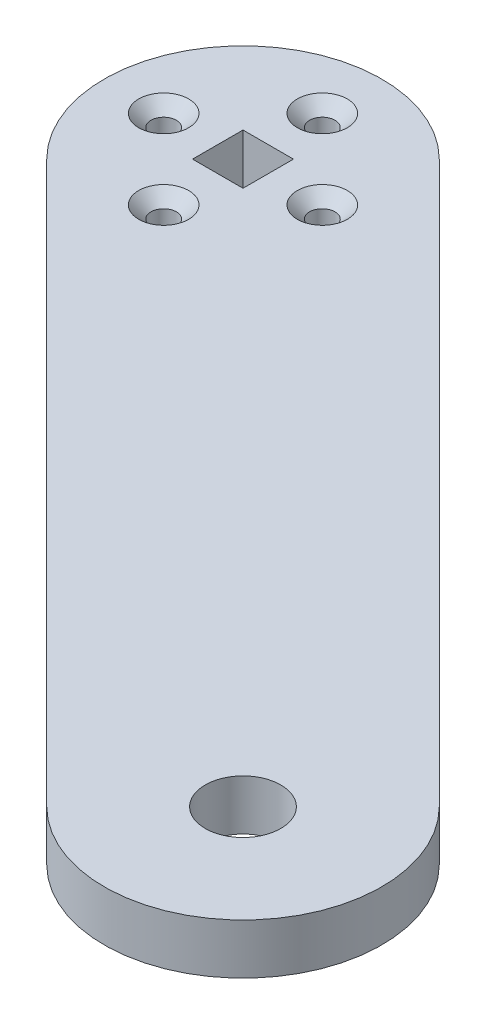
ISO-10303-21;
HEADER;
FILE_DESCRIPTION(('STEP AP214'),'2;1');
FILE_NAME('part.step','',(''),(''),'','','');
FILE_SCHEMA(('AUTOMOTIVE_DESIGN { 1 0 10303 214 1 1 1 1 }'));
ENDSEC;
DATA;
#1=APPLICATION_CONTEXT('core data for automotive mechanical design processes');
#2=APPLICATION_PROTOCOL_DEFINITION('international standard','automotive_design',2000,#1);
#3=PRODUCT_CONTEXT('',#1,'mechanical');
#4=PRODUCT('Part','Part','',(#3));
#5=PRODUCT_RELATED_PRODUCT_CATEGORY('part','',(#4));
#6=PRODUCT_DEFINITION_FORMATION('','',#4);
#7=PRODUCT_DEFINITION_CONTEXT('part definition',#1,'design');
#8=PRODUCT_DEFINITION('design','',#6,#7);
#9=PRODUCT_DEFINITION_SHAPE('','',#8);
#10=(LENGTH_UNIT() NAMED_UNIT(*) SI_UNIT(.MILLI.,.METRE.));
#11=(NAMED_UNIT(*) PLANE_ANGLE_UNIT() SI_UNIT($,.RADIAN.));
#12=(NAMED_UNIT(*) SI_UNIT($,.STERADIAN.) SOLID_ANGLE_UNIT());
#13=UNCERTAINTY_MEASURE_WITH_UNIT(LENGTH_MEASURE(1.E-05),#10,'distance_accuracy_value','');
#14=(GEOMETRIC_REPRESENTATION_CONTEXT(3) GLOBAL_UNCERTAINTY_ASSIGNED_CONTEXT((#13)) GLOBAL_UNIT_ASSIGNED_CONTEXT((#10,
#11,#12)) REPRESENTATION_CONTEXT('',''));
#15=CARTESIAN_POINT('',(0.,0.,0.));
#16=DIRECTION('',(0.,0.,1.));
#17=DIRECTION('',(1.,0.,0.));
#18=AXIS2_PLACEMENT_3D('',#15,#16,#17);
#19=CARTESIAN_POINT('',(0.,-6.35,0.));
#20=DIRECTION('',(0.,1.,0.));
#21=DIRECTION('',(0.,0.,1.));
#22=AXIS2_PLACEMENT_3D('',#19,#20,#21);
#23=CYLINDRICAL_SURFACE('',#22,17.5);
#24=CARTESIAN_POINT('',(0.,0.,0.));
#25=DIRECTION('',(0.,1.,0.));
#26=DIRECTION('',(0.,0.,1.));
#27=AXIS2_PLACEMENT_3D('',#24,#25,#26);
#28=CIRCLE('',#27,17.5);
#29=CARTESIAN_POINT('',(12.3743686707646,0.,-12.3743686707646));
#30=VERTEX_POINT('',#29);
#31=CARTESIAN_POINT('',(-12.3743686707646,0.,12.3743686707646));
#32=VERTEX_POINT('',#31);
#33=EDGE_CURVE('E139',#30,#32,#28,.T.);
#34=ORIENTED_EDGE('',*,*,#33,.F.);
#35=DIRECTION('',(0.,1.,0.));
#36=VECTOR('',#35,1.);
#37=CARTESIAN_POINT('',(12.3743686707646,-6.35,-12.3743686707646));
#38=LINE('',#37,#36);
#39=CARTESIAN_POINT('',(12.3743686707646,-6.35,-12.3743686707646));
#40=VERTEX_POINT('',#39);
#41=EDGE_CURVE('E11',#40,#30,#38,.T.);
#42=ORIENTED_EDGE('',*,*,#41,.F.);
#43=CARTESIAN_POINT('',(0.,-6.35,0.));
#44=DIRECTION('',(0.,1.,0.));
#45=DIRECTION('',(0.,0.,1.));
#46=AXIS2_PLACEMENT_3D('',#43,#44,#45);
#47=CIRCLE('',#46,17.5);
#48=CARTESIAN_POINT('',(-12.3743686707646,-6.35,12.3743686707646));
#49=VERTEX_POINT('',#48);
#50=EDGE_CURVE('E143',#40,#49,#47,.T.);
#51=ORIENTED_EDGE('',*,*,#50,.T.);
#52=DIRECTION('',(0.,1.,0.));
#53=VECTOR('',#52,1.);
#54=CARTESIAN_POINT('',(-12.3743686707646,-6.35,12.3743686707646));
#55=LINE('',#54,#53);
#56=EDGE_CURVE('E40',#49,#32,#55,.T.);
#57=ORIENTED_EDGE('',*,*,#56,.T.);
#58=EDGE_LOOP('',(#34,#42,#51,#57));
#59=FACE_BOUND('',#58,.T.);
#60=ADVANCED_FACE('F37',(#59),#23,.T.);
#61=CARTESIAN_POINT('',(12.3743686707646,-6.35,-12.3743686707646));
#62=DIRECTION('',(0.707106781186549,0.,-0.707106781186546));
#63=DIRECTION('',(-0.707106781186546,0.,-0.707106781186549));
#64=AXIS2_PLACEMENT_3D('',#61,#62,#63);
#65=PLANE('',#64);
#66=DIRECTION('',(-0.707106781186546,0.,-0.707106781186549));
#67=VECTOR('',#66,1.);
#68=CARTESIAN_POINT('',(12.3743686707646,0.,-12.3743686707646));
#69=LINE('',#68,#67);
#70=CARTESIAN_POINT('',(83.0850467894193,0.,58.3363094478903));
#71=VERTEX_POINT('',#70);
#72=EDGE_CURVE('E147',#71,#30,#69,.T.);
#73=ORIENTED_EDGE('',*,*,#72,.F.);
#74=DIRECTION('',(0.,1.,0.));
#75=VECTOR('',#74,1.);
#76=CARTESIAN_POINT('',(83.0850467894193,-6.35,58.3363094478903));
#77=LINE('',#76,#75);
#78=CARTESIAN_POINT('',(83.0850467894193,-6.35,58.3363094478903));
#79=VERTEX_POINT('',#78);
#80=EDGE_CURVE('E45',#79,#71,#77,.T.);
#81=ORIENTED_EDGE('',*,*,#80,.F.);
#82=DIRECTION('',(-0.707106781186546,0.,-0.707106781186549));
#83=VECTOR('',#82,1.);
#84=CARTESIAN_POINT('',(12.3743686707646,-6.35,-12.3743686707646));
#85=LINE('',#84,#83);
#86=EDGE_CURVE('E153',#79,#40,#85,.T.);
#87=ORIENTED_EDGE('',*,*,#86,.T.);
#88=ORIENTED_EDGE('',*,*,#41,.T.);
#89=EDGE_LOOP('',(#73,#81,#87,#88));
#90=FACE_BOUND('',#89,.T.);
#91=ADVANCED_FACE('F179',(#90),#65,.T.);
#92=CARTESIAN_POINT('',(70.7106781186546,-6.35,70.7106781186549));
#93=DIRECTION('',(0.,1.,0.));
#94=DIRECTION('',(0.,0.,1.));
#95=AXIS2_PLACEMENT_3D('',#92,#93,#94);
#96=CYLINDRICAL_SURFACE('',#95,17.5);
#97=CARTESIAN_POINT('',(70.7106781186546,0.,70.7106781186549));
#98=DIRECTION('',(0.,1.,0.));
#99=DIRECTION('',(0.,0.,-1.));
#100=AXIS2_PLACEMENT_3D('',#97,#98,#99);
#101=CIRCLE('',#100,17.5);
#102=CARTESIAN_POINT('',(58.33630944789,0.,83.0850467894194));
#103=VERTEX_POINT('',#102);
#104=EDGE_CURVE('E161',#103,#71,#101,.T.);
#105=ORIENTED_EDGE('',*,*,#104,.F.);
#106=DIRECTION('',(0.,1.,0.));
#107=VECTOR('',#106,1.);
#108=CARTESIAN_POINT('',(58.33630944789,-6.35,83.0850467894194));
#109=LINE('',#108,#107);
#110=CARTESIAN_POINT('',(58.33630944789,-6.35,83.0850467894194));
#111=VERTEX_POINT('',#110);
#112=EDGE_CURVE('E166',#111,#103,#109,.T.);
#113=ORIENTED_EDGE('',*,*,#112,.F.);
#114=CARTESIAN_POINT('',(70.7106781186546,-6.35,70.7106781186549));
#115=DIRECTION('',(0.,1.,0.));
#116=DIRECTION('',(0.,0.,-1.));
#117=AXIS2_PLACEMENT_3D('',#114,#115,#116);
#118=CIRCLE('',#117,17.5);
#119=EDGE_CURVE('E150',#111,#79,#118,.T.);
#120=ORIENTED_EDGE('',*,*,#119,.T.);
#121=ORIENTED_EDGE('',*,*,#80,.T.);
#122=EDGE_LOOP('',(#105,#113,#120,#121));
#123=FACE_BOUND('',#122,.T.);
#124=ADVANCED_FACE('F183',(#123),#96,.T.);
#125=CARTESIAN_POINT('',(-12.3743686707646,-6.35,12.3743686707646));
#126=DIRECTION('',(-0.707106781186549,0.,0.707106781186546));
#127=DIRECTION('',(0.707106781186546,0.,0.707106781186549));
#128=AXIS2_PLACEMENT_3D('',#125,#126,#127);
#129=PLANE('',#128);
#130=DIRECTION('',(0.707106781186546,0.,0.707106781186549));
#131=VECTOR('',#130,1.);
#132=CARTESIAN_POINT('',(-12.3743686707646,0.,12.3743686707646));
#133=LINE('',#132,#131);
#134=EDGE_CURVE('E158',#32,#103,#133,.T.);
#135=ORIENTED_EDGE('',*,*,#134,.F.);
#136=ORIENTED_EDGE('',*,*,#56,.F.);
#137=DIRECTION('',(0.707106781186546,0.,0.707106781186549));
#138=VECTOR('',#137,1.);
#139=CARTESIAN_POINT('',(-12.3743686707646,-6.35,12.3743686707646));
#140=LINE('',#139,#138);
#141=EDGE_CURVE('E146',#49,#111,#140,.T.);
#142=ORIENTED_EDGE('',*,*,#141,.T.);
#143=ORIENTED_EDGE('',*,*,#112,.T.);
#144=EDGE_LOOP('',(#135,#136,#142,#143));
#145=FACE_BOUND('',#144,.T.);
#146=ADVANCED_FACE('F174',(#145),#129,.T.);
#147=CARTESIAN_POINT('',(0.,-6.35,0.));
#148=DIRECTION('',(0.,1.,0.));
#149=DIRECTION('',(0.,0.,1.));
#150=AXIS2_PLACEMENT_3D('',#147,#148,#149);
#151=PLANE('',#150);
#152=CARTESIAN_POINT('',(0.,-6.35,-10.));
#153=DIRECTION('',(0.,1.,0.));
#154=DIRECTION('',(0.,0.,1.));
#155=AXIS2_PLACEMENT_3D('',#152,#153,#154);
#156=CIRCLE('',#155,1.6);
#157=CARTESIAN_POINT('',(0.,-6.35,-8.4));
#158=VERTEX_POINT('',#157);
#159=EDGE_CURVE('E363',#158,#158,#156,.T.);
#160=ORIENTED_EDGE('',*,*,#159,.T.);
#161=EDGE_LOOP('',(#160));
#162=FACE_BOUND('',#161,.T.);
#163=CARTESIAN_POINT('',(-10.,-6.35,0.));
#164=DIRECTION('',(0.,1.,0.));
#165=DIRECTION('',(0.,0.,1.));
#166=AXIS2_PLACEMENT_3D('',#163,#164,#165);
#167=CIRCLE('',#166,1.6);
#168=CARTESIAN_POINT('',(-10.,-6.35,1.6));
#169=VERTEX_POINT('',#168);
#170=EDGE_CURVE('E374',#169,#169,#167,.T.);
#171=ORIENTED_EDGE('',*,*,#170,.T.);
#172=EDGE_LOOP('',(#171));
#173=FACE_BOUND('',#172,.T.);
#174=CARTESIAN_POINT('',(10.,-6.35,0.));
#175=DIRECTION('',(0.,1.,0.));
#176=DIRECTION('',(0.,0.,1.));
#177=AXIS2_PLACEMENT_3D('',#174,#175,#176);
#178=CIRCLE('',#177,1.6);
#179=CARTESIAN_POINT('',(10.,-6.35,1.6));
#180=VERTEX_POINT('',#179);
#181=EDGE_CURVE('E383',#180,#180,#178,.T.);
#182=ORIENTED_EDGE('',*,*,#181,.T.);
#183=EDGE_LOOP('',(#182));
#184=FACE_BOUND('',#183,.T.);
#185=CARTESIAN_POINT('',(0.,-6.35,10.));
#186=DIRECTION('',(0.,1.,0.));
#187=DIRECTION('',(0.,0.,1.));
#188=AXIS2_PLACEMENT_3D('',#185,#186,#187);
#189=CIRCLE('',#188,1.6);
#190=CARTESIAN_POINT('',(0.,-6.35,11.6));
#191=VERTEX_POINT('',#190);
#192=EDGE_CURVE('E392',#191,#191,#189,.T.);
#193=ORIENTED_EDGE('',*,*,#192,.T.);
#194=EDGE_LOOP('',(#193));
#195=FACE_BOUND('',#194,.T.);
#196=CARTESIAN_POINT('',(70.7106781186546,-6.35,70.7106781186549));
#197=DIRECTION('',(0.,1.,0.));
#198=DIRECTION('',(0.,0.,1.));
#199=AXIS2_PLACEMENT_3D('',#196,#197,#198);
#200=CIRCLE('',#199,4.7625);
#201=CARTESIAN_POINT('',(70.7106781186546,-6.35,75.4731781186549));
#202=VERTEX_POINT('',#201);
#203=EDGE_CURVE('E133',#202,#202,#200,.T.);
#204=ORIENTED_EDGE('',*,*,#203,.T.);
#205=EDGE_LOOP('',(#204));
#206=FACE_BOUND('',#205,.T.);
#207=DIRECTION('',(-1.,0.,0.));
#208=VECTOR('',#207,1.);
#209=CARTESIAN_POINT('',(-3.18,-6.35,-3.18));
#210=LINE('',#209,#208);
#211=CARTESIAN_POINT('',(3.18,-6.35,-3.18));
#212=VERTEX_POINT('',#211);
#213=CARTESIAN_POINT('',(-3.18,-6.35,-3.18));
#214=VERTEX_POINT('',#213);
#215=EDGE_CURVE('E110',#212,#214,#210,.T.);
#216=ORIENTED_EDGE('',*,*,#215,.T.);
#217=DIRECTION('',(0.,0.,1.));
#218=VECTOR('',#217,1.);
#219=CARTESIAN_POINT('',(-3.18,-6.35,-3.18));
#220=LINE('',#219,#218);
#221=CARTESIAN_POINT('',(-3.18,-6.35,3.18));
#222=VERTEX_POINT('',#221);
#223=EDGE_CURVE('E104',#214,#222,#220,.T.);
#224=ORIENTED_EDGE('',*,*,#223,.T.);
#225=DIRECTION('',(1.,0.,0.));
#226=VECTOR('',#225,1.);
#227=CARTESIAN_POINT('',(-3.18,-6.35,3.18));
#228=LINE('',#227,#226);
#229=CARTESIAN_POINT('',(3.18,-6.35,3.18));
#230=VERTEX_POINT('',#229);
#231=EDGE_CURVE('E113',#222,#230,#228,.T.);
#232=ORIENTED_EDGE('',*,*,#231,.T.);
#233=DIRECTION('',(0.,0.,-1.));
#234=VECTOR('',#233,1.);
#235=CARTESIAN_POINT('',(3.18,-6.35,-3.18));
#236=LINE('',#235,#234);
#237=EDGE_CURVE('E53',#230,#212,#236,.T.);
#238=ORIENTED_EDGE('',*,*,#237,.T.);
#239=EDGE_LOOP('',(#216,#224,#232,#238));
#240=FACE_BOUND('',#239,.T.);
#241=ORIENTED_EDGE('',*,*,#50,.F.);
#242=ORIENTED_EDGE('',*,*,#86,.F.);
#243=ORIENTED_EDGE('',*,*,#119,.F.);
#244=ORIENTED_EDGE('',*,*,#141,.F.);
#245=EDGE_LOOP('',(#241,#242,#243,#244));
#246=FACE_BOUND('',#245,.T.);
#247=ADVANCED_FACE('F117',(#162,#173,#184,#195,#206,#240,#246),#151,.F.);
#248=CARTESIAN_POINT('',(0.,0.,0.));
#249=DIRECTION('',(0.,1.,0.));
#250=DIRECTION('',(0.,0.,1.));
#251=AXIS2_PLACEMENT_3D('',#248,#249,#250);
#252=PLANE('',#251);
#253=CARTESIAN_POINT('',(0.,0.,-10.));
#254=DIRECTION('',(0.,1.,0.));
#255=DIRECTION('',(0.,0.,1.));
#256=AXIS2_PLACEMENT_3D('',#253,#254,#255);
#257=CIRCLE('',#256,3.15);
#258=CARTESIAN_POINT('',(0.,0.,-6.85));
#259=VERTEX_POINT('',#258);
#260=EDGE_CURVE('E361',#259,#259,#257,.T.);
#261=ORIENTED_EDGE('',*,*,#260,.F.);
#262=EDGE_LOOP('',(#261));
#263=FACE_BOUND('',#262,.T.);
#264=CARTESIAN_POINT('',(-10.,0.,0.));
#265=DIRECTION('',(0.,1.,0.));
#266=DIRECTION('',(0.,0.,1.));
#267=AXIS2_PLACEMENT_3D('',#264,#265,#266);
#268=CIRCLE('',#267,3.15);
#269=CARTESIAN_POINT('',(-10.,0.,3.15));
#270=VERTEX_POINT('',#269);
#271=EDGE_CURVE('E368',#270,#270,#268,.T.);
#272=ORIENTED_EDGE('',*,*,#271,.F.);
#273=EDGE_LOOP('',(#272));
#274=FACE_BOUND('',#273,.T.);
#275=CARTESIAN_POINT('',(10.,0.,0.));
#276=DIRECTION('',(0.,1.,0.));
#277=DIRECTION('',(0.,0.,1.));
#278=AXIS2_PLACEMENT_3D('',#275,#276,#277);
#279=CIRCLE('',#278,3.15);
#280=CARTESIAN_POINT('',(10.,0.,3.15));
#281=VERTEX_POINT('',#280);
#282=EDGE_CURVE('E377',#281,#281,#279,.T.);
#283=ORIENTED_EDGE('',*,*,#282,.F.);
#284=EDGE_LOOP('',(#283));
#285=FACE_BOUND('',#284,.T.);
#286=CARTESIAN_POINT('',(0.,0.,10.));
#287=DIRECTION('',(0.,1.,0.));
#288=DIRECTION('',(0.,0.,1.));
#289=AXIS2_PLACEMENT_3D('',#286,#287,#288);
#290=CIRCLE('',#289,3.15);
#291=CARTESIAN_POINT('',(0.,0.,13.15));
#292=VERTEX_POINT('',#291);
#293=EDGE_CURVE('E386',#292,#292,#290,.T.);
#294=ORIENTED_EDGE('',*,*,#293,.F.);
#295=EDGE_LOOP('',(#294));
#296=FACE_BOUND('',#295,.T.);
#297=CARTESIAN_POINT('',(70.7106781186546,0.,70.7106781186549));
#298=DIRECTION('',(0.,1.,0.));
#299=DIRECTION('',(0.,0.,1.));
#300=AXIS2_PLACEMENT_3D('',#297,#298,#299);
#301=CIRCLE('',#300,4.7625);
#302=CARTESIAN_POINT('',(70.7106781186546,0.,75.4731781186549));
#303=VERTEX_POINT('',#302);
#304=EDGE_CURVE('E126',#303,#303,#301,.T.);
#305=ORIENTED_EDGE('',*,*,#304,.F.);
#306=EDGE_LOOP('',(#305));
#307=FACE_BOUND('',#306,.T.);
#308=DIRECTION('',(0.,0.,1.));
#309=VECTOR('',#308,1.);
#310=CARTESIAN_POINT('',(-3.18,0.,-3.18));
#311=LINE('',#310,#309);
#312=CARTESIAN_POINT('',(-3.18,0.,-3.18));
#313=VERTEX_POINT('',#312);
#314=CARTESIAN_POINT('',(-3.18,0.,3.18));
#315=VERTEX_POINT('',#314);
#316=EDGE_CURVE('E61',#313,#315,#311,.T.);
#317=ORIENTED_EDGE('',*,*,#316,.F.);
#318=DIRECTION('',(-1.,0.,0.));
#319=VECTOR('',#318,1.);
#320=CARTESIAN_POINT('',(-3.18,0.,-3.18));
#321=LINE('',#320,#319);
#322=CARTESIAN_POINT('',(3.18,0.,-3.18));
#323=VERTEX_POINT('',#322);
#324=EDGE_CURVE('E120',#323,#313,#321,.T.);
#325=ORIENTED_EDGE('',*,*,#324,.F.);
#326=DIRECTION('',(0.,0.,-1.));
#327=VECTOR('',#326,1.);
#328=CARTESIAN_POINT('',(3.18,0.,-3.18));
#329=LINE('',#328,#327);
#330=CARTESIAN_POINT('',(3.18,0.,3.18));
#331=VERTEX_POINT('',#330);
#332=EDGE_CURVE('E123',#331,#323,#329,.T.);
#333=ORIENTED_EDGE('',*,*,#332,.F.);
#334=DIRECTION('',(1.,0.,0.));
#335=VECTOR('',#334,1.);
#336=CARTESIAN_POINT('',(-3.18,0.,3.18));
#337=LINE('',#336,#335);
#338=EDGE_CURVE('E132',#315,#331,#337,.T.);
#339=ORIENTED_EDGE('',*,*,#338,.F.);
#340=EDGE_LOOP('',(#317,#325,#333,#339));
#341=FACE_BOUND('',#340,.T.);
#342=ORIENTED_EDGE('',*,*,#33,.T.);
#343=ORIENTED_EDGE('',*,*,#134,.T.);
#344=ORIENTED_EDGE('',*,*,#104,.T.);
#345=ORIENTED_EDGE('',*,*,#72,.T.);
#346=EDGE_LOOP('',(#342,#343,#344,#345));
#347=FACE_BOUND('',#346,.T.);
#348=ADVANCED_FACE('F176',(#263,#274,#285,#296,#307,#341,#347),#252,.T.);
#349=CARTESIAN_POINT('',(-3.18,-6.35,-3.18));
#350=DIRECTION('',(-1.,0.,0.));
#351=DIRECTION('',(0.,0.,1.));
#352=AXIS2_PLACEMENT_3D('',#349,#350,#351);
#353=PLANE('',#352);
#354=ORIENTED_EDGE('',*,*,#316,.T.);
#355=DIRECTION('',(0.,1.,0.));
#356=VECTOR('',#355,1.);
#357=CARTESIAN_POINT('',(-3.18,-6.35,3.18));
#358=LINE('',#357,#356);
#359=EDGE_CURVE('E100',#222,#315,#358,.T.);
#360=ORIENTED_EDGE('',*,*,#359,.F.);
#361=ORIENTED_EDGE('',*,*,#223,.F.);
#362=DIRECTION('',(0.,1.,0.));
#363=VECTOR('',#362,1.);
#364=CARTESIAN_POINT('',(-3.18,-6.35,-3.18));
#365=LINE('',#364,#363);
#366=EDGE_CURVE('E137',#214,#313,#365,.T.);
#367=ORIENTED_EDGE('',*,*,#366,.T.);
#368=EDGE_LOOP('',(#354,#360,#361,#367));
#369=FACE_BOUND('',#368,.T.);
#370=ADVANCED_FACE('F102',(#369),#353,.F.);
#371=CARTESIAN_POINT('',(-3.18,-6.35,-3.18));
#372=DIRECTION('',(0.,0.,-1.));
#373=DIRECTION('',(-1.,0.,0.));
#374=AXIS2_PLACEMENT_3D('',#371,#372,#373);
#375=PLANE('',#374);
#376=ORIENTED_EDGE('',*,*,#324,.T.);
#377=ORIENTED_EDGE('',*,*,#366,.F.);
#378=ORIENTED_EDGE('',*,*,#215,.F.);
#379=DIRECTION('',(0.,1.,0.));
#380=VECTOR('',#379,1.);
#381=CARTESIAN_POINT('',(3.18,-6.35,-3.18));
#382=LINE('',#381,#380);
#383=EDGE_CURVE('E140',#212,#323,#382,.T.);
#384=ORIENTED_EDGE('',*,*,#383,.T.);
#385=EDGE_LOOP('',(#376,#377,#378,#384));
#386=FACE_BOUND('',#385,.T.);
#387=ADVANCED_FACE('F219',(#386),#375,.F.);
#388=CARTESIAN_POINT('',(3.18,-6.35,-3.18));
#389=DIRECTION('',(1.,0.,0.));
#390=DIRECTION('',(0.,0.,-1.));
#391=AXIS2_PLACEMENT_3D('',#388,#389,#390);
#392=PLANE('',#391);
#393=ORIENTED_EDGE('',*,*,#332,.T.);
#394=ORIENTED_EDGE('',*,*,#383,.F.);
#395=ORIENTED_EDGE('',*,*,#237,.F.);
#396=DIRECTION('',(0.,1.,0.));
#397=VECTOR('',#396,1.);
#398=CARTESIAN_POINT('',(3.18,-6.35,3.18));
#399=LINE('',#398,#397);
#400=EDGE_CURVE('E109',#230,#331,#399,.T.);
#401=ORIENTED_EDGE('',*,*,#400,.T.);
#402=EDGE_LOOP('',(#393,#394,#395,#401));
#403=FACE_BOUND('',#402,.T.);
#404=ADVANCED_FACE('F230',(#403),#392,.F.);
#405=CARTESIAN_POINT('',(-3.18,-6.35,3.18));
#406=DIRECTION('',(0.,0.,1.));
#407=DIRECTION('',(1.,0.,0.));
#408=AXIS2_PLACEMENT_3D('',#405,#406,#407);
#409=PLANE('',#408);
#410=ORIENTED_EDGE('',*,*,#338,.T.);
#411=ORIENTED_EDGE('',*,*,#400,.F.);
#412=ORIENTED_EDGE('',*,*,#231,.F.);
#413=ORIENTED_EDGE('',*,*,#359,.T.);
#414=EDGE_LOOP('',(#410,#411,#412,#413));
#415=FACE_BOUND('',#414,.T.);
#416=ADVANCED_FACE('F114',(#415),#409,.F.);
#417=CARTESIAN_POINT('',(70.7106781186546,-6.35,70.7106781186549));
#418=DIRECTION('',(0.,1.,0.));
#419=DIRECTION('',(0.,0.,1.));
#420=AXIS2_PLACEMENT_3D('',#417,#418,#419);
#421=CYLINDRICAL_SURFACE('',#420,4.7625);
#422=ORIENTED_EDGE('',*,*,#203,.F.);
#423=EDGE_LOOP('',(#422));
#424=FACE_BOUND('',#423,.T.);
#425=ORIENTED_EDGE('',*,*,#304,.T.);
#426=EDGE_LOOP('',(#425));
#427=FACE_BOUND('',#426,.T.);
#428=ADVANCED_FACE('F248',(#424,#427),#421,.F.);
#429=CARTESIAN_POINT('',(0.,0.,10.));
#430=DIRECTION('',(0.,1.,0.));
#431=DIRECTION('',(0.,0.,1.));
#432=AXIS2_PLACEMENT_3D('',#429,#430,#431);
#433=CYLINDRICAL_SURFACE('',#432,1.6);
#434=ORIENTED_EDGE('',*,*,#192,.F.);
#435=EDGE_LOOP('',(#434));
#436=FACE_BOUND('',#435,.T.);
#437=CARTESIAN_POINT('',(0.,-1.55,10.));
#438=DIRECTION('',(0.,1.,0.));
#439=DIRECTION('',(0.,0.,1.));
#440=AXIS2_PLACEMENT_3D('',#437,#438,#439);
#441=CIRCLE('',#440,1.6);
#442=CARTESIAN_POINT('',(0.,-1.55,11.6));
#443=VERTEX_POINT('',#442);
#444=EDGE_CURVE('E389',#443,#443,#441,.T.);
#445=ORIENTED_EDGE('',*,*,#444,.T.);
#446=EDGE_LOOP('',(#445));
#447=FACE_BOUND('',#446,.T.);
#448=ADVANCED_FACE('F257',(#436,#447),#433,.F.);
#449=CARTESIAN_POINT('',(0.,0.,10.));
#450=DIRECTION('',(0.,1.,0.));
#451=DIRECTION('',(0.,0.,1.));
#452=AXIS2_PLACEMENT_3D('',#449,#450,#451);
#453=CONICAL_SURFACE('',#452,3.15,0.785398163397448);
#454=ORIENTED_EDGE('',*,*,#444,.F.);
#455=EDGE_LOOP('',(#454));
#456=FACE_BOUND('',#455,.T.);
#457=ORIENTED_EDGE('',*,*,#293,.T.);
#458=EDGE_LOOP('',(#457));
#459=FACE_BOUND('',#458,.T.);
#460=ADVANCED_FACE('F281',(#456,#459),#453,.F.);
#461=CARTESIAN_POINT('',(10.,0.,0.));
#462=DIRECTION('',(0.,1.,0.));
#463=DIRECTION('',(0.,0.,1.));
#464=AXIS2_PLACEMENT_3D('',#461,#462,#463);
#465=CYLINDRICAL_SURFACE('',#464,1.6);
#466=ORIENTED_EDGE('',*,*,#181,.F.);
#467=EDGE_LOOP('',(#466));
#468=FACE_BOUND('',#467,.T.);
#469=CARTESIAN_POINT('',(10.,-1.55,0.));
#470=DIRECTION('',(0.,1.,0.));
#471=DIRECTION('',(0.,0.,1.));
#472=AXIS2_PLACEMENT_3D('',#469,#470,#471);
#473=CIRCLE('',#472,1.6);
#474=CARTESIAN_POINT('',(10.,-1.55,1.6));
#475=VERTEX_POINT('',#474);
#476=EDGE_CURVE('E380',#475,#475,#473,.T.);
#477=ORIENTED_EDGE('',*,*,#476,.T.);
#478=EDGE_LOOP('',(#477));
#479=FACE_BOUND('',#478,.T.);
#480=ADVANCED_FACE('F291',(#468,#479),#465,.F.);
#481=CARTESIAN_POINT('',(10.,0.,0.));
#482=DIRECTION('',(0.,1.,0.));
#483=DIRECTION('',(0.,0.,1.));
#484=AXIS2_PLACEMENT_3D('',#481,#482,#483);
#485=CONICAL_SURFACE('',#484,3.15,0.785398163397448);
#486=ORIENTED_EDGE('',*,*,#476,.F.);
#487=EDGE_LOOP('',(#486));
#488=FACE_BOUND('',#487,.T.);
#489=ORIENTED_EDGE('',*,*,#282,.T.);
#490=EDGE_LOOP('',(#489));
#491=FACE_BOUND('',#490,.T.);
#492=ADVANCED_FACE('F301',(#488,#491),#485,.F.);
#493=CARTESIAN_POINT('',(-10.,0.,0.));
#494=DIRECTION('',(0.,1.,0.));
#495=DIRECTION('',(0.,0.,1.));
#496=AXIS2_PLACEMENT_3D('',#493,#494,#495);
#497=CYLINDRICAL_SURFACE('',#496,1.6);
#498=ORIENTED_EDGE('',*,*,#170,.F.);
#499=EDGE_LOOP('',(#498));
#500=FACE_BOUND('',#499,.T.);
#501=CARTESIAN_POINT('',(-10.,-1.55,0.));
#502=DIRECTION('',(0.,1.,0.));
#503=DIRECTION('',(0.,0.,1.));
#504=AXIS2_PLACEMENT_3D('',#501,#502,#503);
#505=CIRCLE('',#504,1.6);
#506=CARTESIAN_POINT('',(-10.,-1.55,1.6));
#507=VERTEX_POINT('',#506);
#508=EDGE_CURVE('E371',#507,#507,#505,.T.);
#509=ORIENTED_EDGE('',*,*,#508,.T.);
#510=EDGE_LOOP('',(#509));
#511=FACE_BOUND('',#510,.T.);
#512=ADVANCED_FACE('F311',(#500,#511),#497,.F.);
#513=CARTESIAN_POINT('',(-10.,0.,0.));
#514=DIRECTION('',(0.,1.,0.));
#515=DIRECTION('',(0.,0.,1.));
#516=AXIS2_PLACEMENT_3D('',#513,#514,#515);
#517=CONICAL_SURFACE('',#516,3.15,0.785398163397448);
#518=ORIENTED_EDGE('',*,*,#508,.F.);
#519=EDGE_LOOP('',(#518));
#520=FACE_BOUND('',#519,.T.);
#521=ORIENTED_EDGE('',*,*,#271,.T.);
#522=EDGE_LOOP('',(#521));
#523=FACE_BOUND('',#522,.T.);
#524=ADVANCED_FACE('F321',(#520,#523),#517,.F.);
#525=CARTESIAN_POINT('',(0.,0.,-10.));
#526=DIRECTION('',(0.,1.,0.));
#527=DIRECTION('',(0.,0.,1.));
#528=AXIS2_PLACEMENT_3D('',#525,#526,#527);
#529=CYLINDRICAL_SURFACE('',#528,1.6);
#530=ORIENTED_EDGE('',*,*,#159,.F.);
#531=EDGE_LOOP('',(#530));
#532=FACE_BOUND('',#531,.T.);
#533=CARTESIAN_POINT('',(0.,-1.55,-10.));
#534=DIRECTION('',(0.,1.,0.));
#535=DIRECTION('',(0.,0.,1.));
#536=AXIS2_PLACEMENT_3D('',#533,#534,#535);
#537=CIRCLE('',#536,1.6);
#538=CARTESIAN_POINT('',(0.,-1.55,-8.4));
#539=VERTEX_POINT('',#538);
#540=EDGE_CURVE('E358',#539,#539,#537,.T.);
#541=ORIENTED_EDGE('',*,*,#540,.T.);
#542=EDGE_LOOP('',(#541));
#543=FACE_BOUND('',#542,.T.);
#544=ADVANCED_FACE('F331',(#532,#543),#529,.F.);
#545=CARTESIAN_POINT('',(0.,0.,-10.));
#546=DIRECTION('',(0.,1.,0.));
#547=DIRECTION('',(0.,0.,1.));
#548=AXIS2_PLACEMENT_3D('',#545,#546,#547);
#549=CONICAL_SURFACE('',#548,3.15,0.785398163397448);
#550=ORIENTED_EDGE('',*,*,#540,.F.);
#551=EDGE_LOOP('',(#550));
#552=FACE_BOUND('',#551,.T.);
#553=ORIENTED_EDGE('',*,*,#260,.T.);
#554=EDGE_LOOP('',(#553));
#555=FACE_BOUND('',#554,.T.);
#556=ADVANCED_FACE('F341',(#552,#555),#549,.F.);
#557=CLOSED_SHELL('',(#60,#91,#124,#146,#247,#348,#370,#387,#404,#416,#428,#448,#460,#480,#492,
#512,#524,#544,#556));
#558=MANIFOLD_SOLID_BREP('B2',#557);
#559=ADVANCED_BREP_SHAPE_REPRESENTATION('',(#18,#558),#14);
#560=SHAPE_DEFINITION_REPRESENTATION(#9,#559);
ENDSEC;
END-ISO-10303-21;
